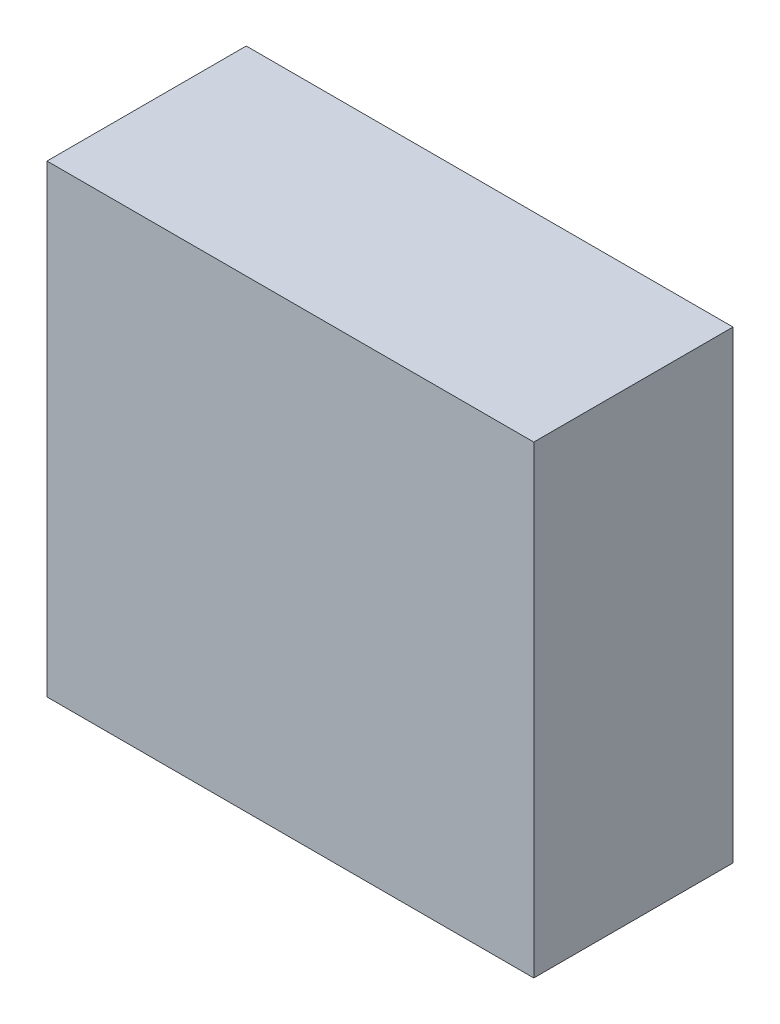
ISO-10303-21;
HEADER;
FILE_DESCRIPTION(('STEP AP214'),'2;1');
FILE_NAME('part.step','',(''),(''),'','','');
FILE_SCHEMA(('AUTOMOTIVE_DESIGN { 1 0 10303 214 1 1 1 1 }'));
ENDSEC;
DATA;
#1=APPLICATION_CONTEXT('core data for automotive mechanical design processes');
#2=APPLICATION_PROTOCOL_DEFINITION('international standard','automotive_design',2000,#1);
#3=PRODUCT_CONTEXT('',#1,'mechanical');
#4=PRODUCT('Part','Part','',(#3));
#5=PRODUCT_RELATED_PRODUCT_CATEGORY('part','',(#4));
#6=PRODUCT_DEFINITION_FORMATION('','',#4);
#7=PRODUCT_DEFINITION_CONTEXT('part definition',#1,'design');
#8=PRODUCT_DEFINITION('design','',#6,#7);
#9=PRODUCT_DEFINITION_SHAPE('','',#8);
#10=(LENGTH_UNIT() NAMED_UNIT(*) SI_UNIT(.MILLI.,.METRE.));
#11=(NAMED_UNIT(*) PLANE_ANGLE_UNIT() SI_UNIT($,.RADIAN.));
#12=(NAMED_UNIT(*) SI_UNIT($,.STERADIAN.) SOLID_ANGLE_UNIT());
#13=UNCERTAINTY_MEASURE_WITH_UNIT(LENGTH_MEASURE(1.E-05),#10,'distance_accuracy_value','');
#14=(GEOMETRIC_REPRESENTATION_CONTEXT(3) GLOBAL_UNCERTAINTY_ASSIGNED_CONTEXT((#13)) GLOBAL_UNIT_ASSIGNED_CONTEXT((#10,
#11,#12)) REPRESENTATION_CONTEXT('',''));
#15=CARTESIAN_POINT('',(0.,0.,0.));
#16=DIRECTION('',(0.,0.,1.));
#17=DIRECTION('',(1.,0.,0.));
#18=AXIS2_PLACEMENT_3D('',#15,#16,#17);
#19=CARTESIAN_POINT('',(21.5,-20.5,17.6));
#20=DIRECTION('',(-1.,0.,0.));
#21=DIRECTION('',(0.,0.,1.));
#22=AXIS2_PLACEMENT_3D('',#19,#20,#21);
#23=PLANE('',#22);
#24=DIRECTION('',(0.,1.,0.));
#25=VECTOR('',#24,1.);
#26=CARTESIAN_POINT('',(21.5,-20.5,0.));
#27=LINE('',#26,#25);
#28=CARTESIAN_POINT('',(21.5,-20.5,0.));
#29=VERTEX_POINT('',#28);
#30=CARTESIAN_POINT('',(21.5,20.5,0.));
#31=VERTEX_POINT('',#30);
#32=EDGE_CURVE('E102',#29,#31,#27,.T.);
#33=ORIENTED_EDGE('',*,*,#32,.T.);
#34=DIRECTION('',(0.,0.,-1.));
#35=VECTOR('',#34,1.);
#36=CARTESIAN_POINT('',(21.5,20.5,17.6));
#37=LINE('',#36,#35);
#38=CARTESIAN_POINT('',(21.5,20.5,17.6));
#39=VERTEX_POINT('',#38);
#40=EDGE_CURVE('E11',#39,#31,#37,.T.);
#41=ORIENTED_EDGE('',*,*,#40,.F.);
#42=DIRECTION('',(0.,1.,0.));
#43=VECTOR('',#42,1.);
#44=CARTESIAN_POINT('',(21.5,-20.5,17.6));
#45=LINE('',#44,#43);
#46=CARTESIAN_POINT('',(21.5,-20.5,17.6));
#47=VERTEX_POINT('',#46);
#48=EDGE_CURVE('E90',#47,#39,#45,.T.);
#49=ORIENTED_EDGE('',*,*,#48,.F.);
#50=DIRECTION('',(0.,0.,-1.));
#51=VECTOR('',#50,1.);
#52=CARTESIAN_POINT('',(21.5,-20.5,17.6));
#53=LINE('',#52,#51);
#54=EDGE_CURVE('E98',#47,#29,#53,.T.);
#55=ORIENTED_EDGE('',*,*,#54,.T.);
#56=EDGE_LOOP('',(#33,#41,#49,#55));
#57=FACE_BOUND('',#56,.T.);
#58=ADVANCED_FACE('F39',(#57),#23,.F.);
#59=CARTESIAN_POINT('',(-21.5,20.5,17.6));
#60=DIRECTION('',(0.,-1.,0.));
#61=DIRECTION('',(0.,0.,-1.));
#62=AXIS2_PLACEMENT_3D('',#59,#60,#61);
#63=PLANE('',#62);
#64=DIRECTION('',(-1.,0.,0.));
#65=VECTOR('',#64,1.);
#66=CARTESIAN_POINT('',(-21.5,20.5,0.));
#67=LINE('',#66,#65);
#68=CARTESIAN_POINT('',(-21.5,20.5,0.));
#69=VERTEX_POINT('',#68);
#70=EDGE_CURVE('E94',#31,#69,#67,.T.);
#71=ORIENTED_EDGE('',*,*,#70,.T.);
#72=DIRECTION('',(0.,0.,-1.));
#73=VECTOR('',#72,1.);
#74=CARTESIAN_POINT('',(-21.5,20.5,17.6));
#75=LINE('',#74,#73);
#76=CARTESIAN_POINT('',(-21.5,20.5,17.6));
#77=VERTEX_POINT('',#76);
#78=EDGE_CURVE('E47',#77,#69,#75,.T.);
#79=ORIENTED_EDGE('',*,*,#78,.F.);
#80=DIRECTION('',(-1.,0.,0.));
#81=VECTOR('',#80,1.);
#82=CARTESIAN_POINT('',(-21.5,20.5,17.6));
#83=LINE('',#82,#81);
#84=EDGE_CURVE('E85',#39,#77,#83,.T.);
#85=ORIENTED_EDGE('',*,*,#84,.F.);
#86=ORIENTED_EDGE('',*,*,#40,.T.);
#87=EDGE_LOOP('',(#71,#79,#85,#86));
#88=FACE_BOUND('',#87,.T.);
#89=ADVANCED_FACE('F93',(#88),#63,.F.);
#90=CARTESIAN_POINT('',(-21.5,-20.5,17.6));
#91=DIRECTION('',(1.,0.,0.));
#92=DIRECTION('',(0.,0.,-1.));
#93=AXIS2_PLACEMENT_3D('',#90,#91,#92);
#94=PLANE('',#93);
#95=DIRECTION('',(0.,-1.,0.));
#96=VECTOR('',#95,1.);
#97=CARTESIAN_POINT('',(-21.5,-20.5,0.));
#98=LINE('',#97,#96);
#99=CARTESIAN_POINT('',(-21.5,-20.5,0.));
#100=VERTEX_POINT('',#99);
#101=EDGE_CURVE('E72',#69,#100,#98,.T.);
#102=ORIENTED_EDGE('',*,*,#101,.T.);
#103=DIRECTION('',(0.,0.,-1.));
#104=VECTOR('',#103,1.);
#105=CARTESIAN_POINT('',(-21.5,-20.5,17.6));
#106=LINE('',#105,#104);
#107=CARTESIAN_POINT('',(-21.5,-20.5,17.6));
#108=VERTEX_POINT('',#107);
#109=EDGE_CURVE('E95',#108,#100,#106,.T.);
#110=ORIENTED_EDGE('',*,*,#109,.F.);
#111=DIRECTION('',(0.,-1.,0.));
#112=VECTOR('',#111,1.);
#113=CARTESIAN_POINT('',(-21.5,-20.5,17.6));
#114=LINE('',#113,#112);
#115=EDGE_CURVE('E88',#77,#108,#114,.T.);
#116=ORIENTED_EDGE('',*,*,#115,.F.);
#117=ORIENTED_EDGE('',*,*,#78,.T.);
#118=EDGE_LOOP('',(#102,#110,#116,#117));
#119=FACE_BOUND('',#118,.T.);
#120=ADVANCED_FACE('F96',(#119),#94,.F.);
#121=CARTESIAN_POINT('',(-21.5,-20.5,17.6));
#122=DIRECTION('',(0.,1.,0.));
#123=DIRECTION('',(0.,0.,1.));
#124=AXIS2_PLACEMENT_3D('',#121,#122,#123);
#125=PLANE('',#124);
#126=DIRECTION('',(1.,0.,0.));
#127=VECTOR('',#126,1.);
#128=CARTESIAN_POINT('',(-21.5,-20.5,0.));
#129=LINE('',#128,#127);
#130=EDGE_CURVE('E78',#100,#29,#129,.T.);
#131=ORIENTED_EDGE('',*,*,#130,.T.);
#132=ORIENTED_EDGE('',*,*,#54,.F.);
#133=DIRECTION('',(1.,0.,0.));
#134=VECTOR('',#133,1.);
#135=CARTESIAN_POINT('',(-21.5,-20.5,17.6));
#136=LINE('',#135,#134);
#137=EDGE_CURVE('E55',#108,#47,#136,.T.);
#138=ORIENTED_EDGE('',*,*,#137,.F.);
#139=ORIENTED_EDGE('',*,*,#109,.T.);
#140=EDGE_LOOP('',(#131,#132,#138,#139));
#141=FACE_BOUND('',#140,.T.);
#142=ADVANCED_FACE('F109',(#141),#125,.F.);
#143=CARTESIAN_POINT('',(0.,0.,17.6));
#144=DIRECTION('',(0.,0.,-1.));
#145=DIRECTION('',(-1.,0.,0.));
#146=AXIS2_PLACEMENT_3D('',#143,#144,#145);
#147=PLANE('',#146);
#148=ORIENTED_EDGE('',*,*,#48,.T.);
#149=ORIENTED_EDGE('',*,*,#84,.T.);
#150=ORIENTED_EDGE('',*,*,#115,.T.);
#151=ORIENTED_EDGE('',*,*,#137,.T.);
#152=EDGE_LOOP('',(#148,#149,#150,#151));
#153=FACE_BOUND('',#152,.T.);
#154=ADVANCED_FACE('F86',(#153),#147,.F.);
#155=CARTESIAN_POINT('',(0.,0.,0.));
#156=DIRECTION('',(0.,0.,-1.));
#157=DIRECTION('',(-1.,0.,0.));
#158=AXIS2_PLACEMENT_3D('',#155,#156,#157);
#159=PLANE('',#158);
#160=ORIENTED_EDGE('',*,*,#32,.F.);
#161=ORIENTED_EDGE('',*,*,#130,.F.);
#162=ORIENTED_EDGE('',*,*,#101,.F.);
#163=ORIENTED_EDGE('',*,*,#70,.F.);
#164=EDGE_LOOP('',(#160,#161,#162,#163));
#165=FACE_BOUND('',#164,.T.);
#166=ADVANCED_FACE('F112',(#165),#159,.T.);
#167=CLOSED_SHELL('',(#58,#89,#120,#142,#154,#166));
#168=MANIFOLD_SOLID_BREP('B2',#167);
#169=ADVANCED_BREP_SHAPE_REPRESENTATION('',(#18,#168),#14);
#170=SHAPE_DEFINITION_REPRESENTATION(#9,#169);
ENDSEC;
END-ISO-10303-21;
